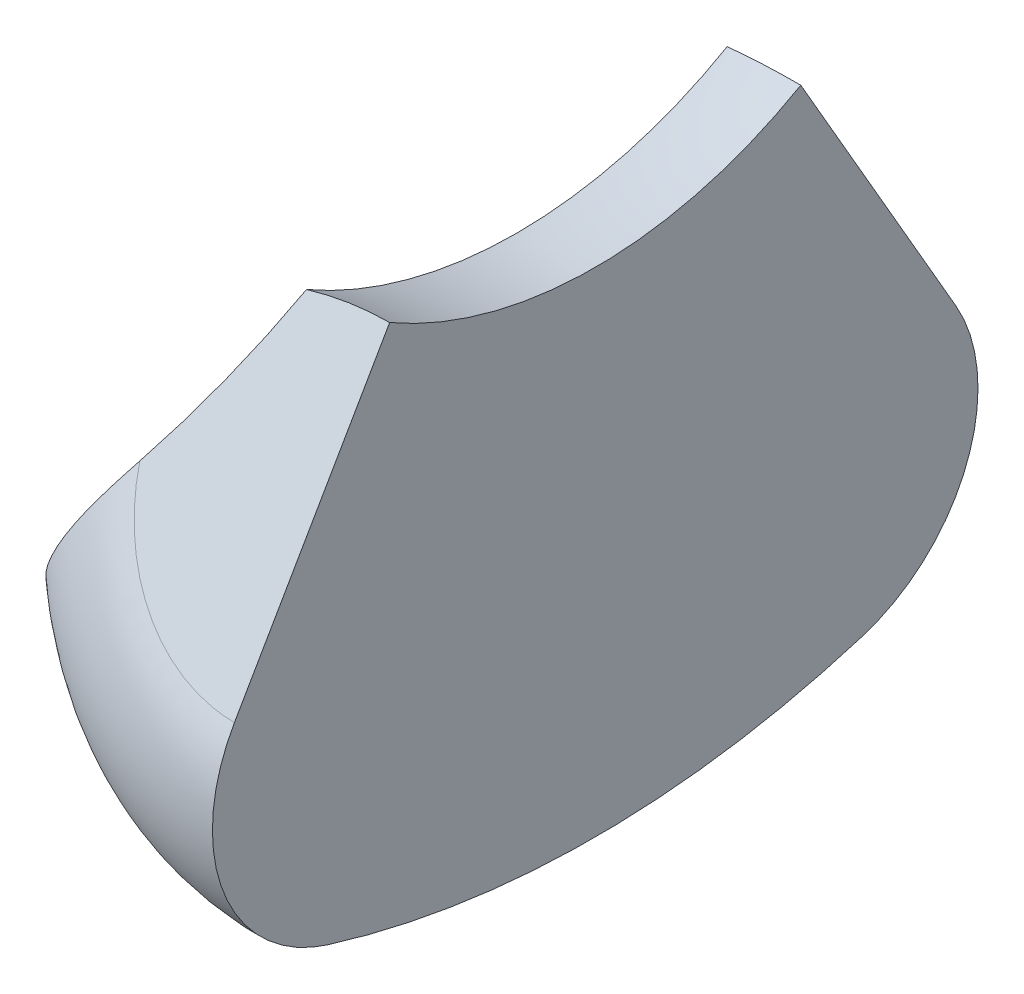
ISO-10303-21;
HEADER;
FILE_DESCRIPTION(('STEP AP214'),'2;1');
FILE_NAME('part.step','',(''),(''),'','','');
FILE_SCHEMA(('AUTOMOTIVE_DESIGN { 1 0 10303 214 1 1 1 1 }'));
ENDSEC;
DATA;
#1=APPLICATION_CONTEXT('core data for automotive mechanical design processes');
#2=APPLICATION_PROTOCOL_DEFINITION('international standard','automotive_design',2000,#1);
#3=PRODUCT_CONTEXT('',#1,'mechanical');
#4=PRODUCT('Part','Part','',(#3));
#5=PRODUCT_RELATED_PRODUCT_CATEGORY('part','',(#4));
#6=PRODUCT_DEFINITION_FORMATION('','',#4);
#7=PRODUCT_DEFINITION_CONTEXT('part definition',#1,'design');
#8=PRODUCT_DEFINITION('design','',#6,#7);
#9=PRODUCT_DEFINITION_SHAPE('','',#8);
#10=(LENGTH_UNIT() NAMED_UNIT(*) SI_UNIT(.MILLI.,.METRE.));
#11=(NAMED_UNIT(*) PLANE_ANGLE_UNIT() SI_UNIT($,.RADIAN.));
#12=(NAMED_UNIT(*) SI_UNIT($,.STERADIAN.) SOLID_ANGLE_UNIT());
#13=UNCERTAINTY_MEASURE_WITH_UNIT(LENGTH_MEASURE(1.E-05),#10,'distance_accuracy_value','');
#14=(GEOMETRIC_REPRESENTATION_CONTEXT(3) GLOBAL_UNCERTAINTY_ASSIGNED_CONTEXT((#13)) GLOBAL_UNIT_ASSIGNED_CONTEXT((#10,
#11,#12)) REPRESENTATION_CONTEXT('',''));
#15=CARTESIAN_POINT('',(0.,0.,0.));
#16=DIRECTION('',(0.,0.,1.));
#17=DIRECTION('',(1.,0.,0.));
#18=AXIS2_PLACEMENT_3D('',#15,#16,#17);
#19=CARTESIAN_POINT('',(14.2,0.,0.));
#20=DIRECTION('',(-1.,0.,0.));
#21=DIRECTION('',(0.,-1.,0.));
#22=AXIS2_PLACEMENT_3D('',#19,#20,#21);
#23=TOROIDAL_SURFACE('',#22,9.,4.);
#24=CARTESIAN_POINT('',(14.2,0.,0.));
#25=DIRECTION('',(-1.,0.,0.));
#26=DIRECTION('',(0.,-1.,0.));
#27=AXIS2_PLACEMENT_3D('',#24,#25,#26);
#28=CIRCLE('',#27,5.);
#29=CARTESIAN_POINT('',(14.2,-4.33012701892219,-2.50000000000001));
#30=VERTEX_POINT('',#29);
#31=CARTESIAN_POINT('',(14.2,-4.33012701892219,2.5));
#32=VERTEX_POINT('',#31);
#33=EDGE_CURVE('E132',#30,#32,#28,.T.);
#34=ORIENTED_EDGE('',*,*,#33,.F.);
#35=CARTESIAN_POINT('',(14.2,-7.79422863405994,-4.50000000000001));
#36=DIRECTION('',(0.,-0.500000000000001,0.866025403784438));
#37=DIRECTION('',(-1.,0.,0.));
#38=AXIS2_PLACEMENT_3D('',#35,#36,#37);
#39=CIRCLE('',#38,4.);
#40=CARTESIAN_POINT('',(13.2466613471033,-4.42995173409023,-2.55763382617405));
#41=VERTEX_POINT('',#40);
#42=EDGE_CURVE('E100',#30,#41,#39,.T.);
#43=ORIENTED_EDGE('',*,*,#42,.T.);
#44=CARTESIAN_POINT('',(13.2466613471033,0.,0.));
#45=DIRECTION('',(-1.,0.,0.));
#46=DIRECTION('',(0.,-1.,0.));
#47=AXIS2_PLACEMENT_3D('',#44,#45,#46);
#48=CIRCLE('',#47,5.11526765234809);
#49=CARTESIAN_POINT('',(13.2466613471033,-4.42995173409023,2.55763382617405));
#50=VERTEX_POINT('',#49);
#51=EDGE_CURVE('E95',#41,#50,#48,.T.);
#52=ORIENTED_EDGE('',*,*,#51,.T.);
#53=CARTESIAN_POINT('',(14.2,-7.79422863405994,4.50000000000001));
#54=DIRECTION('',(0.,0.500000000000001,0.866025403784438));
#55=DIRECTION('',(-1.,0.,0.));
#56=AXIS2_PLACEMENT_3D('',#53,#54,#55);
#57=CIRCLE('',#56,4.);
#58=EDGE_CURVE('E98',#32,#50,#57,.T.);
#59=ORIENTED_EDGE('',*,*,#58,.F.);
#60=EDGE_LOOP('',(#34,#43,#52,#59));
#61=FACE_BOUND('',#60,.T.);
#62=ADVANCED_FACE('F33',(#61),#23,.T.);
#63=CARTESIAN_POINT('',(14.2,-4.33012701892219,-2.50000000000001));
#64=DIRECTION('',(1.,0.,0.));
#65=DIRECTION('',(0.,1.,0.));
#66=AXIS2_PLACEMENT_3D('',#63,#64,#65);
#67=PLANE('',#66);
#68=CARTESIAN_POINT('',(14.2,0.,0.));
#69=DIRECTION('',(-1.,0.,0.));
#70=DIRECTION('',(0.,-1.,0.));
#71=AXIS2_PLACEMENT_3D('',#68,#69,#70);
#72=CIRCLE('',#71,11.);
#73=CARTESIAN_POINT('',(14.2,-10.5103069827376,-3.24552724971102));
#74=VERTEX_POINT('',#73);
#75=CARTESIAN_POINT('',(14.2,-10.5103069827376,3.24552724971101));
#76=VERTEX_POINT('',#75);
#77=EDGE_CURVE('E129',#74,#76,#72,.T.);
#78=ORIENTED_EDGE('',*,*,#77,.F.);
#79=CARTESIAN_POINT('',(14.1999999999999,-8.59934207678548,-2.65543138612728));
#80=DIRECTION('',(1.,0.,0.));
#81=DIRECTION('',(0.,1.,0.));
#82=AXIS2_PLACEMENT_3D('',#79,#80,#81);
#83=CIRCLE('',#82,2.);
#84=CARTESIAN_POINT('',(14.2,-7.59934207678532,-4.38748219369607));
#85=VERTEX_POINT('',#84);
#86=EDGE_CURVE('E192',#74,#85,#83,.T.);
#87=ORIENTED_EDGE('',*,*,#86,.T.);
#88=DIRECTION('',(0.,0.866025403784438,0.500000000000001));
#89=VECTOR('',#88,1.);
#90=CARTESIAN_POINT('',(14.2,-4.33012701892219,-2.50000000000001));
#91=LINE('',#90,#89);
#92=EDGE_CURVE('E102',#85,#30,#91,.T.);
#93=ORIENTED_EDGE('',*,*,#92,.T.);
#94=ORIENTED_EDGE('',*,*,#33,.T.);
#95=DIRECTION('',(0.,0.866025403784438,-0.500000000000001));
#96=VECTOR('',#95,1.);
#97=CARTESIAN_POINT('',(14.2,-4.33012701892219,2.5));
#98=LINE('',#97,#96);
#99=CARTESIAN_POINT('',(14.2,-7.59934207678532,4.38748219369607));
#100=VERTEX_POINT('',#99);
#101=EDGE_CURVE('E108',#100,#32,#98,.T.);
#102=ORIENTED_EDGE('',*,*,#101,.F.);
#103=CARTESIAN_POINT('',(14.2,-8.59934207678547,2.65543138612727));
#104=DIRECTION('',(1.,0.,0.));
#105=DIRECTION('',(0.,1.,0.));
#106=AXIS2_PLACEMENT_3D('',#103,#104,#105);
#107=CIRCLE('',#106,2.);
#108=EDGE_CURVE('E208',#100,#76,#107,.T.);
#109=ORIENTED_EDGE('',*,*,#108,.T.);
#110=EDGE_LOOP('',(#78,#87,#93,#94,#102,#109));
#111=FACE_BOUND('',#110,.T.);
#112=ADVANCED_FACE('F153',(#111),#67,.T.);
#113=CARTESIAN_POINT('',(14.2,0.,0.));
#114=DIRECTION('',(-1.,0.,0.));
#115=DIRECTION('',(0.,-1.,0.));
#116=AXIS2_PLACEMENT_3D('',#113,#114,#115);
#117=TOROIDAL_SURFACE('',#116,7.,4.);
#118=CARTESIAN_POINT('',(10.8407822103364,0.,0.));
#119=DIRECTION('',(-1.,0.,0.));
#120=DIRECTION('',(0.,-1.,0.));
#121=AXIS2_PLACEMENT_3D('',#118,#119,#120);
#122=CIRCLE('',#121,9.17155608760339);
#123=CARTESIAN_POINT('',(10.8407822103364,-8.83027431117204,-2.47864815121266));
#124=VERTEX_POINT('',#123);
#125=CARTESIAN_POINT('',(10.8407822103364,-8.83027431117204,2.47864815121265));
#126=VERTEX_POINT('',#125);
#127=EDGE_CURVE('E101',#124,#126,#122,.T.);
#128=ORIENTED_EDGE('',*,*,#127,.F.);
#129=CARTESIAN_POINT('',(12.2249032960197,-5.52454645390097,-3.18959838231033));
#130=CARTESIAN_POINT('',(10.3385819820484,-5.2762326548454,-3.04623434358209));
#131=CARTESIAN_POINT('',(10.2498065920394,-6.21748362648852,-1.3889514382053));
#132=CARTESIAN_POINT('',(12.2155894488538,-5.577622661398,-3.22024194499631));
#133=CARTESIAN_POINT('',(10.3037202512503,-5.3735018871853,-3.10239276105741));
#134=CARTESIAN_POINT('',(10.2311788977065,-6.32782190660059,-1.43150047388376));
#135=CARTESIAN_POINT('',(12.2088690584926,-5.63101476867328,-3.25106789250429));
#136=CARTESIAN_POINT('',(10.2737721738444,-5.47232193938927,-3.1594465447987));
#137=CARTESIAN_POINT('',(10.2177381169845,-6.43878325731117,-1.47481684447684));
#138=CARTESIAN_POINT('',(12.2006785074126,-5.73810593375173,-3.31289700549016));
#139=CARTESIAN_POINT('',(10.2238351894735,-5.67336435075574,-3.27551843511967));
#140=CARTESIAN_POINT('',(10.2013570148259,-6.66127031068925,-1.56265854102597));
#141=CARTESIAN_POINT('',(12.1992089579181,-5.79180502656089,-3.34390019117877));
#142=CARTESIAN_POINT('',(10.2039407579885,-5.77558965351556,-3.33453824118604));
#143=CARTESIAN_POINT('',(10.1984179158376,-6.77279607754458,-1.60718400711898));
#144=CARTESIAN_POINT('',(12.2027727866078,-5.95280526146827,-3.43685372014214));
#145=CARTESIAN_POINT('',(10.1599847060356,-6.08768426836323,-3.51472615108097));
#146=CARTESIAN_POINT('',(10.2055455732148,-7.10705143145941,-1.74202710296695));
#147=CARTESIAN_POINT('',(12.215769597685,-6.06006084841535,-3.49877776213813));
#148=CARTESIAN_POINT('',(10.1525545493161,-6.30038126076179,-3.6375268168981));
#149=CARTESIAN_POINT('',(10.2315391953613,-7.32956612160526,-1.83365283209383));
#150=CARTESIAN_POINT('',(12.2626663328305,-6.26954753000947,-3.61972495414813));
#151=CARTESIAN_POINT('',(10.1837650805238,-6.7267846788366,-3.88371094510697));
#152=CARTESIAN_POINT('',(10.3253326656695,-7.76384508951257,-2.01553667719363));
#153=CARTESIAN_POINT('',(12.296283359369,-6.37182674074108,-3.67877588399653));
#154=CARTESIAN_POINT('',(10.2224876329642,-6.94020337010627,-4.00692828396162));
#155=CARTESIAN_POINT('',(10.392566718771,-7.97571357204845,-2.10579664316646));
#156=CARTESIAN_POINT('',(12.3835233684967,-6.56976705220837,-3.79305677610565));
#157=CARTESIAN_POINT('',(10.3474640813605,-7.36304315397121,-4.25105494700012));
#158=CARTESIAN_POINT('',(10.5670467370155,-8.38545025612664,-2.28270066936003));
#159=CARTESIAN_POINT('',(12.4371374491575,-6.66543107534529,-3.84828842561551));
#160=CARTESIAN_POINT('',(10.4342693563477,-7.57201990789643,-4.37170773213323));
#161=CARTESIAN_POINT('',(10.6742748983016,-8.58332464075198,-2.36934631948297));
#162=CARTESIAN_POINT('',(12.5610446536194,-6.84415409626259,-3.9514742098525));
#163=CARTESIAN_POINT('',(10.6521539988476,-7.9705265283923,-4.60178563675036));
#164=CARTESIAN_POINT('',(10.9220893072518,-8.95276544976622,-2.53281833641504));
#165=CARTESIAN_POINT('',(12.6307547132948,-6.92751669201741,-3.99960362695189));
#166=CARTESIAN_POINT('',(10.782137038053,-8.16000250021316,-4.7111796400861));
#167=CARTESIAN_POINT('',(11.061509426661,-9.1249673112014,-2.6098690046903));
#168=CARTESIAN_POINT('',(12.7858394943639,-7.08240487400438,-4.08902836051636));
#169=CARTESIAN_POINT('',(11.0848329752697,-8.51812215602699,-4.91794011977231));
#170=CARTESIAN_POINT('',(11.3716789887918,-9.44475225553772,-2.75406933757755));
#171=CARTESIAN_POINT('',(12.8711955407349,-7.1539443807018,-4.13033171396581));
#172=CARTESIAN_POINT('',(11.2576349749836,-8.68620641471867,-5.01498361177449));
#173=CARTESIAN_POINT('',(11.5423910814682,-9.59236429207303,-2.82123063559038));
#174=CARTESIAN_POINT('',(13.019487022849,-7.25789772709348,-4.19034920648821));
#175=CARTESIAN_POINT('',(11.5663860338082,-8.93346093979017,-5.15773607838288));
#176=CARTESIAN_POINT('',(11.838974045699,-9.80676977121457,-2.91933635682062));
#177=CARTESIAN_POINT('',(13.0783479421257,-7.29475083663195,-4.21162635920072));
#178=CARTESIAN_POINT('',(11.6910699854732,-9.02196595245914,-5.20883447127194));
#179=CARTESIAN_POINT('',(11.9566958842787,-9.8827570739802,-2.95424971288262));
#180=CARTESIAN_POINT('',(13.2003514967133,-7.36266324779574,-4.25083560806745));
#181=CARTESIAN_POINT('',(11.9530675630893,-9.18622931836544,-5.30367196979594));
#182=CARTESIAN_POINT('',(12.2007029934421,-10.0227548496447,-3.01876152903963));
#183=CARTESIAN_POINT('',(13.2634929818505,-7.39372409743468,-4.26876859796775));
#184=CARTESIAN_POINT('',(12.0903245166477,-9.26186665514571,-5.34734120654681));
#185=CARTESIAN_POINT('',(12.3269859636783,-10.0867685225766,-3.04836140911134));
#186=CARTESIAN_POINT('',(13.426866934179,-7.46405906788514,-4.30937651209077));
#187=CARTESIAN_POINT('',(12.4495711753079,-9.43430335600853,-5.44689758220814));
#188=CARTESIAN_POINT('',(12.6537338683924,-10.2316978474835,-3.11552549729447));
#189=CARTESIAN_POINT('',(13.5294502653464,-7.49932125831168,-4.32973514722575));
#190=CARTESIAN_POINT('',(12.678043757278,-9.52137936747143,-5.4971709408662));
#191=CARTESIAN_POINT('',(12.8589005309015,-10.3043324636602,-3.14933724778629));
#192=CARTESIAN_POINT('',(13.7401028732581,-7.55449077162285,-4.36158728058701));
#193=CARTESIAN_POINT('',(13.1520693035712,-9.6584238029765,-5.57629358259599));
#194=CARTESIAN_POINT('',(13.2802057467733,-10.41795751653,-3.20232097860054));
#195=CARTESIAN_POINT('',(13.8481800576314,-7.57437525290083,-4.37306759120555));
#196=CARTESIAN_POINT('',(13.3972296830308,-9.70806916418562,-5.60495634525409));
#197=CARTESIAN_POINT('',(13.4963601153937,-10.4589008800267,-3.22147118065998));
#198=CARTESIAN_POINT('',(14.0666721029376,-7.5980781605443,-4.38675247131408));
#199=CARTESIAN_POINT('',(13.895254049998,-9.76741190161116,-5.63921789068118));
#200=CARTESIAN_POINT('',(13.9333442057444,-10.5077054071713,-3.24430520099778));
#201=CARTESIAN_POINT('',(14.1770857775064,-7.60190455266925,-4.38896163983745));
#202=CARTESIAN_POINT('',(14.1476236690124,-9.77700994786705,-5.64475932527071));
#203=CARTESIAN_POINT('',(14.1541715547468,-10.5155829734055,-3.24799668770889));
#204=CARTESIAN_POINT('',(14.3419663510373,-7.59553813623247,-4.3852859875939));
#205=CARTESIAN_POINT('',(14.5244096539128,-9.76104506846745,-5.63554199785177));
#206=CARTESIAN_POINT('',(14.4839327019225,-10.502475006721,-3.2418607298531));
#207=CARTESIAN_POINT('',(14.3968271453934,-7.59139384774936,-4.38289328152258));
#208=CARTESIAN_POINT('',(14.6496449019071,-9.75065908857438,-5.6295456495647));
#209=CARTESIAN_POINT('',(14.5936542907256,-10.4939424035436,-3.2378655576804));
#210=CARTESIAN_POINT('',(14.5059509319979,-7.5791106298516,-4.37580156236279));
#211=CARTESIAN_POINT('',(14.8983271397571,-9.71991068070146,-5.61179304800212));
#212=CARTESIAN_POINT('',(14.811901864054,-10.4686510021424,-3.22603334800435));
#213=CARTESIAN_POINT('',(14.5602139072838,-7.57097158738646,-4.37110248400459));
#214=CARTESIAN_POINT('',(15.0217129242231,-9.69956337365273,-5.60004552480026));
#215=CARTESIAN_POINT('',(14.9204278146543,-10.4518919711129,-3.21819620177416));
#216=CARTESIAN_POINT('',(14.61400911174,-7.5608588727377,-4.3652639054799));
#217=CARTESIAN_POINT('',(15.143744413636,-9.67431330365864,-5.58546739009211));
#218=CARTESIAN_POINT('',(15.0280182234801,-10.4310675944497,-3.20846590549112));
#219=(BOUNDED_SURFACE() B_SPLINE_SURFACE(3,2,((#129,#130,#131),(#132,#133,#134),(#135,#136,
#137),(#138,#139,#140),(#141,#142,#143),(#144,#145,#146),(#147,#148,#149),(#150,#151,#152),
(#153,#154,#155),(#156,#157,#158),(#159,#160,#161),(#162,#163,#164),(#165,#166,#167),(#168,#169,
#170),(#171,#172,#173),(#174,#175,#176),(#177,#178,#179),(#180,#181,#182),(#183,#184,#185),
(#186,#187,#188),(#189,#190,#191),(#192,#193,#194),(#195,#196,#197),(#198,#199,#200),(#201,#202,
#203),(#204,#205,#206),(#207,#208,#209),(#210,#211,#212),(#213,#214,#215),(#216,#217,#218)),
.UNSPECIFIED.,.F.,.F.,.F.) B_SPLINE_SURFACE_WITH_KNOTS((4,2,2,2,2,2,2,2,2,2,2,2,2,2,4),(3,3),
(0.,0.185857798137875,0.371737230351368,0.7433180189816,1.10991154519576,1.47634207230365,
1.83114831689517,2.18553379086519,2.40303552379177,2.62047904460288,2.9499393591644,
3.27988810964002,3.60967316671135,3.77471069254347,3.93975288916325),(0.,1.),
.UNSPECIFIED.) GEOMETRIC_REPRESENTATION_ITEM() RATIONAL_B_SPLINE_SURFACE(((1.,0.723554665672272,
1.),(1.,0.72038971221704,1.),(1.,0.717264802827632,1.),(1.,0.71110910886469,1.),(1.,
0.70807833528974,1.),(1.,0.69915222345318,1.),(1.,0.693420034095531,1.),(1.,0.682586924133604,
1.),(1.,0.677478563416475,1.),(1.,0.667877940081129,1.),(1.,0.66338540453607,1.),(1.,
0.655203635171287,1.),(1.,0.6514934392586,1.),(1.,0.644740931009477,1.),(1.,0.641697831836822,
1.),(1.,0.637347129010042,1.),(1.,0.63582319140784,1.),(1.,0.633039194900552,1.),(1.,
0.631779065480192,1.),(1.,0.628944968736906,1.),(1.,0.627543743821374,1.),(1.,0.625363353672976,
1.),(1.,0.624585113744113,1.),(1.,0.623658343696233,1.),(1.,0.623509501358605,1.),(1.,
0.623758007431819,1.),(1.,0.623919645784626,1.),(1.,0.624400016195136,1.),(1.,0.624718752698677,
1.),(1.,0.625115826088795,1.))) REPRESENTATION_ITEM('') SURFACE());
#220=CARTESIAN_POINT('',(10.2498065920394,-6.21748362648852,-1.3889514382053));
#221=CARTESIAN_POINT('',(10.2311788977065,-6.32782190660059,-1.43150047388376));
#222=CARTESIAN_POINT('',(10.2177381169845,-6.43878325731117,-1.47481684447684));
#223=CARTESIAN_POINT('',(10.2013570148259,-6.66127031068925,-1.56265854102597));
#224=CARTESIAN_POINT('',(10.1984179158376,-6.77279607754458,-1.60718400711898));
#225=CARTESIAN_POINT('',(10.2055455732148,-7.10705143145941,-1.74202710296695));
#226=CARTESIAN_POINT('',(10.2315391953613,-7.32956612160526,-1.83365283209383));
#227=CARTESIAN_POINT('',(10.3253326656695,-7.76384508951257,-2.01553667719363));
#228=CARTESIAN_POINT('',(10.392566718771,-7.97571357204845,-2.10579664316646));
#229=CARTESIAN_POINT('',(10.5670467370155,-8.38545025612664,-2.28270066936003));
#230=CARTESIAN_POINT('',(10.6742748983016,-8.58332464075198,-2.36934631948297));
#231=CARTESIAN_POINT('',(10.9220893072518,-8.95276544976622,-2.53281833641504));
#232=CARTESIAN_POINT('',(11.061509426661,-9.1249673112014,-2.6098690046903));
#233=CARTESIAN_POINT('',(11.3716789887918,-9.44475225553772,-2.75406933757755));
#234=CARTESIAN_POINT('',(11.5423910814682,-9.59236429207303,-2.82123063559038));
#235=CARTESIAN_POINT('',(11.838974045699,-9.80676977121457,-2.91933635682062));
#236=CARTESIAN_POINT('',(11.9566958842787,-9.8827570739802,-2.95424971288262));
#237=CARTESIAN_POINT('',(12.2007029934421,-10.0227548496447,-3.01876152903963));
#238=CARTESIAN_POINT('',(12.3269859636783,-10.0867685225766,-3.04836140911134));
#239=CARTESIAN_POINT('',(12.6537338683924,-10.2316978474835,-3.11552549729447));
#240=CARTESIAN_POINT('',(12.8589005309015,-10.3043324636602,-3.14933724778629));
#241=CARTESIAN_POINT('',(13.2802057467733,-10.41795751653,-3.20232097860054));
#242=CARTESIAN_POINT('',(13.4963601153937,-10.4589008800267,-3.22147118065998));
#243=CARTESIAN_POINT('',(13.9333442057444,-10.5077054071713,-3.24430520099778));
#244=CARTESIAN_POINT('',(14.1541715547468,-10.5155829734055,-3.24799668770889));
#245=CARTESIAN_POINT('',(14.4839327019225,-10.502475006721,-3.2418607298531));
#246=CARTESIAN_POINT('',(14.5936542907256,-10.4939424035436,-3.2378655576804));
#247=CARTESIAN_POINT('',(14.811901864054,-10.4686510021424,-3.22603334800435));
#248=CARTESIAN_POINT('',(14.9204278146543,-10.4518919711129,-3.21819620177416));
#249=CARTESIAN_POINT('',(15.0280182234801,-10.4310675944497,-3.20846590549112));
#250=B_SPLINE_CURVE_WITH_KNOTS('',3,(#220,#221,#222,#223,#224,#225,#226,#227,#228,#229,#230,
#231,#232,#233,#234,#235,#236,#237,#238,#239,#240,#241,#242,#243,#244,#245,#246,#247,#248,#249),
.UNSPECIFIED.,.F.,.F.,(4,2,2,2,2,2,2,2,2,2,2,2,2,2,4),(0.,0.185857798137875,0.371737230351368,
0.7433180189816,1.10991154519576,1.47634207230365,1.83114831689517,2.18553379086519,
2.40303552379177,2.62047904460288,2.9499393591644,3.27988810964002,3.60967316671135,
3.77471069254347,3.93975288916325),.UNSPECIFIED.);
#251=EDGE_CURVE('E141',#124,#74,#250,.T.);
#252=ORIENTED_EDGE('',*,*,#251,.T.);
#253=ORIENTED_EDGE('',*,*,#77,.T.);
#254=CARTESIAN_POINT('',(14.9849356055584,-7.45674109076653,4.30515147603141));
#255=CARTESIAN_POINT('',(15.9761446057498,-9.41629966703639,5.43650314753365));
#256=CARTESIAN_POINT('',(15.7698712111168,-10.2166128150827,3.10857019054481));
#257=CARTESIAN_POINT('',(14.9336646452154,-7.47619167786341,4.31638127772769));
#258=CARTESIAN_POINT('',(15.8624423868553,-9.46422563634474,5.46417321881501));
#259=CARTESIAN_POINT('',(15.6673292909931,-10.2566852345395,3.12718081691162));
#260=CARTESIAN_POINT('',(14.8814604657359,-7.49373855668852,4.3265119729408));
#261=CARTESIAN_POINT('',(15.7460695949088,-9.50757159870966,5.48919902185468));
#262=CARTESIAN_POINT('',(15.5629209318455,-10.2928305137489,3.14399771401151));
#263=CARTESIAN_POINT('',(14.7755119120426,-7.52490950323707,4.3445085273215));
#264=CARTESIAN_POINT('',(15.5085832562822,-9.58482162254917,5.53379934391332));
#265=CARTESIAN_POINT('',(15.3510238237034,-10.3570341962179,3.17390545637616));
#266=CARTESIAN_POINT('',(14.7217674940146,-7.53853345924521,4.35237432199023));
#267=CARTESIAN_POINT('',(15.3875212790844,-9.61868690927099,5.55335147631835));
#268=CARTESIAN_POINT('',(15.2435349870803,-10.3850923691763,3.18699619552889));
#269=CARTESIAN_POINT('',(14.5587752926045,-7.57333405123417,4.37246645314302));
#270=CARTESIAN_POINT('',(15.0186030107985,-9.70546326453962,5.60345182839199));
#271=CARTESIAN_POINT('',(14.9175505836771,-10.456758916319,3.22045801817622));
#272=CARTESIAN_POINT('',(14.4477135818413,-7.58846024849375,4.38119956720265));
#273=CARTESIAN_POINT('',(14.7657819995044,-9.74331090999125,5.62530317668168));
#274=CARTESIAN_POINT('',(14.6954271632506,-10.4879022372581,3.23503870401007));
#275=CARTESIAN_POINT('',(14.2260716050206,-7.60189170174614,4.38895422035353));
#276=CARTESIAN_POINT('',(14.2596165654579,-9.77697766162001,5.64474068479728));
#277=CARTESIAN_POINT('',(14.2521432104664,-10.5155565185088,3.2479843445893));
#278=CARTESIAN_POINT('',(14.1155111660432,-7.60045737330818,4.38812611044376));
#279=CARTESIAN_POINT('',(14.0068483533331,-9.77337920014937,5.64266311209854));
#280=CARTESIAN_POINT('',(14.0310223322896,-10.5126036441138,3.24660034557955));
#281=CARTESIAN_POINT('',(13.896403725156,-7.58146466419023,4.37716066472188));
#282=CARTESIAN_POINT('',(13.5069202904571,-9.7257992554562,5.61519281822191));
#283=CARTESIAN_POINT('',(13.5928074502959,-10.4734983963361,3.22829882261508));
#284=CARTESIAN_POINT('',(13.7878532962421,-7.56393693043034,4.36704102291732));
#285=CARTESIAN_POINT('',(13.2602480685989,-9.68199021106122,5.58989965464753));
#286=CARTESIAN_POINT('',(13.3757065924701,-10.4374091251039,3.21141082317559));
#287=CARTESIAN_POINT('',(13.6209488380666,-7.5241636765338,4.34407792407361));
#288=CARTESIAN_POINT('',(12.883437536899,-9.58296983598186,5.5327302144402));
#289=CARTESIAN_POINT('',(13.0418976761414,-10.3554978608482,3.17319064319986));
#290=CARTESIAN_POINT('',(13.5608845487427,-7.50709675232159,4.33422433078544));
#291=CARTESIAN_POINT('',(12.7486219656932,-9.54063661079975,5.50828911548564));
#292=CARTESIAN_POINT('',(12.9217690975057,-10.3203465337705,3.15680490809211));
#293=CARTESIAN_POINT('',(13.4429237611839,-7.46804251663361,4.31167635729799));
#294=CARTESIAN_POINT('',(12.4854980325246,-9.44412954222966,5.452570733468));
#295=CARTESIAN_POINT('',(12.6858475223786,-10.2398974867141,3.11937649559228));
#296=CARTESIAN_POINT('',(13.3850276437258,-7.44605434556979,4.29898148081531));
#297=CARTESIAN_POINT('',(12.3572599157664,-9.39001411477072,5.42132717685727));
#298=CARTESIAN_POINT('',(12.5700552874405,-10.1945979941667,3.09833300464289));
#299=CARTESIAN_POINT('',(13.227382378156,-7.37816412837936,4.25978504564507));
#300=CARTESIAN_POINT('',(12.0113581424598,-9.22392808106295,5.32543736058745));
#301=CARTESIAN_POINT('',(12.2547647563319,-10.054706418093,3.03350197650778));
#302=CARTESIAN_POINT('',(13.1305192664756,-7.32705312938213,4.23027609661547));
#303=CARTESIAN_POINT('',(11.8021510985353,-9.09989091119293,5.25382446717348));
#304=CARTESIAN_POINT('',(12.0610385330959,-9.94936268280706,2.98484125910576));
#305=CARTESIAN_POINT('',(12.9938442331154,-7.24037347725549,4.18023157612689));
#306=CARTESIAN_POINT('',(11.5125932234723,-8.89153976329912,5.13353287585102));
#307=CARTESIAN_POINT('',(11.7876884663191,-9.77062737537769,2.90278834614662));
#308=CARTESIAN_POINT('',(12.9496836733278,-7.20977668372276,4.16256650914443));
#309=CARTESIAN_POINT('',(11.4203356262214,-8.81857786009994,5.09140830139838));
#310=CARTESIAN_POINT('',(11.6993673466842,-9.70752402063096,2.87389447680387));
#311=CARTESIAN_POINT('',(12.8644577557454,-7.1454416389998,4.1254226537553));
#312=CARTESIAN_POINT('',(11.2446435048624,-8.66617087589369,5.00341608804053));
#313=CARTESIAN_POINT('',(11.5289155114682,-9.57480640343743,2.81332973435026));
#314=CARTESIAN_POINT('',(12.823394823544,-7.11170097127539,4.10594247016198));
#315=CARTESIAN_POINT('',(11.1612207690762,-8.5867847629914,4.95758249438648));
#316=CARTESIAN_POINT('',(11.446789647074,-9.50518713235475,2.78165672616712));
#317=CARTESIAN_POINT('',(12.7055342750001,-7.0063487735238,4.04511735043038));
#318=CARTESIAN_POINT('',(10.9261663985725,-8.34129144732238,4.81584686250071));
#319=CARTESIAN_POINT('',(11.2110685500284,-9.2877497675492,2.68311085780022));
#320=CARTESIAN_POINT('',(12.6337778702411,-6.93042413134228,4.00128223782875));
#321=CARTESIAN_POINT('',(10.7880007024205,-8.16665505703986,4.71502049556079));
#322=CARTESIAN_POINT('',(11.0675557405608,-9.13097505424849,2.6125372664866));
#323=CARTESIAN_POINT('',(12.505661797137,-6.76938337933103,3.90830531630456));
#324=CARTESIAN_POINT('',(10.5525437210709,-7.80253646696899,4.50479652956643));
#325=CARTESIAN_POINT('',(10.8113235943463,-8.79823749322639,2.46421684179907));
#326=CARTESIAN_POINT('',(12.4493057191794,-6.68426513257355,3.85916227362618));
#327=CARTESIAN_POINT('',(10.4550226093863,-7.61353369169224,4.39567572638281));
#328=CARTESIAN_POINT('',(10.6986114383745,-8.62227018435481,2.38646834132967));
#329=CARTESIAN_POINT('',(12.3767641912758,-6.5506711314286,3.78203174110302));
#330=CARTESIAN_POINT('',(10.338857067016,-7.32176111511696,4.22722075075492));
#331=CARTESIAN_POINT('',(10.5535283825437,-8.34589980101259,2.26580391788466));
#332=CARTESIAN_POINT('',(12.3544132677143,-6.50463712346044,3.75545399421072));
#333=CARTESIAN_POINT('',(10.3050689133653,-7.22256656335714,4.16995074959424));
#334=CARTESIAN_POINT('',(10.5088265354234,-8.25063647877304,2.22445179144738));
#335=CARTESIAN_POINT('',(12.3141641505139,-6.4111825204655,3.70149795401459));
#336=CARTESIAN_POINT('',(10.2482074200657,-7.0233338140469,4.05492366814858));
#337=CARTESIAN_POINT('',(10.4283283010348,-8.05717314743199,2.14102356643253));
#338=CARTESIAN_POINT('',(12.2962616508941,-6.36376331637358,3.67412046376736));
#339=CARTESIAN_POINT('',(10.2250637103814,-6.92334318432379,3.99719405116151));
#340=CARTESIAN_POINT('',(10.3925233018047,-7.95897608211665,2.09894821045036));
#341=CARTESIAN_POINT('',(12.2493068597192,-6.21976521546232,3.59098312144345));
#342=CARTESIAN_POINT('',(10.1715405661158,-6.62415370308036,3.82445692362691));
#343=CARTESIAN_POINT('',(10.2986137194643,-7.66067443919275,1.97205577066072));
#344=CARTESIAN_POINT('',(12.2270215486102,-6.12147227793162,3.53423366750066));
#345=CARTESIAN_POINT('',(10.1563090411925,-6.42391164707912,3.70884711869151));
#346=CARTESIAN_POINT('',(10.2540430972262,-7.45691412228742,1.88659629045952));
#347=CARTESIAN_POINT('',(12.200438074035,-5.91971747470017,3.41775047754468));
#348=CARTESIAN_POINT('',(10.1657669469616,-6.02282015807835,3.47727683954725));
#349=CARTESIAN_POINT('',(10.200876148064,-7.03838222061768,1.71408772837787));
#350=CARTESIAN_POINT('',(12.1967726443183,-5.81619314078775,3.35798067549267));
#351=CARTESIAN_POINT('',(10.1911702962402,-5.82224331678567,3.36147374623371));
#352=CARTESIAN_POINT('',(10.1935452886394,-6.82347114118277,1.62708240185456));
#353=CARTESIAN_POINT('',(12.2058691705892,-5.66166599198026,3.26876438453156));
#354=CARTESIAN_POINT('',(10.2582224873196,-5.52948000909198,3.19244677172792));
#355=CARTESIAN_POINT('',(10.2117383411818,-6.50247196266839,1.49984009732543));
#356=CARTESIAN_POINT('',(12.2113369569028,-5.61027085649422,3.23909138922365));
#357=CARTESIAN_POINT('',(10.285144884161,-5.43382180395545,3.13721848124214));
#358=CARTESIAN_POINT('',(10.2226739138071,-6.39567384200186,1.45796030151358));
#359=CARTESIAN_POINT('',(12.2270708205939,-5.50803642618046,3.18006631336156));
#360=CARTESIAN_POINT('',(10.347885026138,-5.24611471632765,3.02884574367143));
#361=CARTESIAN_POINT('',(10.2541416411863,-6.1831708820644,1.37557537303412));
#362=CARTESIAN_POINT('',(12.2373366858806,-5.4571971068855,3.1507142186812));
#363=CARTESIAN_POINT('',(10.3836220730062,-5.15405476574359,2.97569490642014));
#364=CARTESIAN_POINT('',(10.2746733717588,-6.07746599468008,1.33507017968949));
#365=CARTESIAN_POINT('',(12.2499663742985,-5.40678037843004,3.12160610693578));
#366=CARTESIAN_POINT('',(10.423693624695,-5.06363353845519,2.92349018650473));
#367=CARTESIAN_POINT('',(10.2999327485969,-5.97261261637239,1.29538941901105));
#368=(BOUNDED_SURFACE() B_SPLINE_SURFACE(3,2,((#254,#255,#256),(#257,#258,#259),(#260,#261,
#262),(#263,#264,#265),(#266,#267,#268),(#269,#270,#271),(#272,#273,#274),(#275,#276,#277),
(#278,#279,#280),(#281,#282,#283),(#284,#285,#286),(#287,#288,#289),(#290,#291,#292),(#293,#294,
#295),(#296,#297,#298),(#299,#300,#301),(#302,#303,#304),(#305,#306,#307),(#308,#309,#310),
(#311,#312,#313),(#314,#315,#316),(#317,#318,#319),(#320,#321,#322),(#323,#324,#325),(#326,#327,
#328),(#329,#330,#331),(#332,#333,#334),(#335,#336,#337),(#338,#339,#340),(#341,#342,#343),
(#344,#345,#346),(#347,#348,#349),(#350,#351,#352),(#353,#354,#355),(#356,#357,#358),(#359,#360,
#361),(#362,#363,#364),(#365,#366,#367)),.UNSPECIFIED.,.F.,.F.,
.F.) B_SPLINE_SURFACE_WITH_KNOTS((4,2,2,2,2,2,2,2,2,2,2,2,2,2,2,2,2,2,4),(3,3),(0.,
0.16781767943948,0.335640137445956,0.671107369220793,1.00130663160934,1.33087839169057,
1.52025468254189,1.70966407736456,2.04800521546968,2.21750649101766,2.38713914548624,
2.72534907312853,3.06363778291208,3.2364571227716,3.40910851969458,3.75451121848952,
4.11157627599523,4.29019737250632,4.46881057413162),(0.,1.),
.UNSPECIFIED.) GEOMETRIC_REPRESENTATION_ITEM() RATIONAL_B_SPLINE_SURFACE(((1.,0.629244457050967,
1.),(1.,0.628465910198575,1.),(1.,0.627767496445484,1.),(1.,0.626531568614565,1.),(1.,
0.625994059118882,1.),(1.,0.624624380537014,1.),(1.,0.624034235742752,1.),(1.,0.623510007225912,
1.),(1.,0.623565766654515,1.),(1.,0.624307653625026,1.),(1.,0.624992583029983,1.),(1.,
0.626561250071192,1.),(1.,0.627236476659767,1.),(1.,0.628791095509568,1.),(1.,0.629670523439396,
1.),(1.,0.632405922699654,1.),(1.,0.634486030084998,1.),(1.,0.638079234779655,1.),(1.,
0.639357287247737,1.),(1.,0.642070711480831,1.),(1.,0.643506204414809,1.),(1.,0.648036219763668,
1.),(1.,0.651361763431026,1.),(1.,0.658598494127641,1.),(1.,0.662509817395388,1.),(1.,
0.668825853562085,1.),(1.,0.671031702730829,1.),(1.,0.675576582260252,1.),(1.,0.67791548111456,
1.),(1.,0.685128745166831,1.),(1.,0.690198437408236,1.),(1.,0.700958583419514,1.),(1.,
0.706664217240154,1.),(1.,0.715489065565745,1.),(1.,0.718475854624022,1.),(1.,0.72452302178763,
1.),(1.,0.72758339663456,1.),(1.,0.730673291641164,1.))) REPRESENTATION_ITEM('') SURFACE());
#369=CARTESIAN_POINT('',(15.7698712111168,-10.2166128150827,3.10857019054481));
#370=CARTESIAN_POINT('',(15.6673292909931,-10.2566852345395,3.12718081691162));
#371=CARTESIAN_POINT('',(15.5629209318455,-10.2928305137489,3.14399771401151));
#372=CARTESIAN_POINT('',(15.3510238237034,-10.3570341962179,3.17390545637616));
#373=CARTESIAN_POINT('',(15.2435349870803,-10.3850923691763,3.18699619552889));
#374=CARTESIAN_POINT('',(14.9175505836771,-10.456758916319,3.22045801817622));
#375=CARTESIAN_POINT('',(14.6954271632506,-10.4879022372581,3.23503870401007));
#376=CARTESIAN_POINT('',(14.2521432104664,-10.5155565185088,3.2479843445893));
#377=CARTESIAN_POINT('',(14.0310223322896,-10.5126036441138,3.24660034557955));
#378=CARTESIAN_POINT('',(13.5928074502959,-10.4734983963361,3.22829882261508));
#379=CARTESIAN_POINT('',(13.3757065924701,-10.4374091251039,3.21141082317559));
#380=CARTESIAN_POINT('',(13.0418976761414,-10.3554978608482,3.17319064319986));
#381=CARTESIAN_POINT('',(12.9217690975057,-10.3203465337705,3.15680490809211));
#382=CARTESIAN_POINT('',(12.6858475223786,-10.2398974867141,3.11937649559228));
#383=CARTESIAN_POINT('',(12.5700552874405,-10.1945979941667,3.09833300464289));
#384=CARTESIAN_POINT('',(12.2547647563319,-10.054706418093,3.03350197650778));
#385=CARTESIAN_POINT('',(12.0610385330959,-9.94936268280706,2.98484125910576));
#386=CARTESIAN_POINT('',(11.7876884663191,-9.77062737537769,2.90278834614662));
#387=CARTESIAN_POINT('',(11.6993673466842,-9.70752402063096,2.87389447680387));
#388=CARTESIAN_POINT('',(11.5289155114682,-9.57480640343744,2.81332973435026));
#389=CARTESIAN_POINT('',(11.446789647074,-9.50518713235475,2.78165672616712));
#390=CARTESIAN_POINT('',(11.2110685500284,-9.2877497675492,2.68311085780022));
#391=CARTESIAN_POINT('',(11.0675557405608,-9.13097505424849,2.6125372664866));
#392=CARTESIAN_POINT('',(10.8113235943463,-8.79823749322639,2.46421684179907));
#393=CARTESIAN_POINT('',(10.6986114383745,-8.62227018435481,2.38646834132967));
#394=CARTESIAN_POINT('',(10.5535283825437,-8.34589980101259,2.26580391788466));
#395=CARTESIAN_POINT('',(10.5088265354234,-8.25063647877305,2.22445179144738));
#396=CARTESIAN_POINT('',(10.4283283010348,-8.05717314743199,2.14102356643253));
#397=CARTESIAN_POINT('',(10.3925233018047,-7.95897608211665,2.09894821045036));
#398=CARTESIAN_POINT('',(10.2986137194643,-7.66067443919275,1.97205577066072));
#399=CARTESIAN_POINT('',(10.2540430972262,-7.45691412228742,1.88659629045952));
#400=CARTESIAN_POINT('',(10.200876148064,-7.03838222061768,1.71408772837787));
#401=CARTESIAN_POINT('',(10.1935452886394,-6.82347114118277,1.62708240185456));
#402=CARTESIAN_POINT('',(10.2117383411818,-6.50247196266839,1.49984009732543));
#403=CARTESIAN_POINT('',(10.2226739138071,-6.39567384200186,1.45796030151358));
#404=CARTESIAN_POINT('',(10.2541416411863,-6.1831708820644,1.37557537303412));
#405=CARTESIAN_POINT('',(10.2746733717588,-6.07746599468008,1.33507017968949));
#406=CARTESIAN_POINT('',(10.2999327485969,-5.97261261637239,1.29538941901105));
#407=B_SPLINE_CURVE_WITH_KNOTS('',3,(#369,#370,#371,#372,#373,#374,#375,#376,#377,#378,#379,
#380,#381,#382,#383,#384,#385,#386,#387,#388,#389,#390,#391,#392,#393,#394,#395,#396,#397,#398,
#399,#400,#401,#402,#403,#404,#405,#406),.UNSPECIFIED.,.F.,.F.,(4,2,2,2,2,2,2,2,2,2,2,2,2,2,2,2,
2,2,4),(0.,0.16781767943948,0.335640137445956,0.671107369220793,1.00130663160934,
1.33087839169057,1.52025468254189,1.70966407736456,2.04800521546968,2.21750649101766,
2.38713914548624,2.72534907312853,3.06363778291208,3.2364571227716,3.40910851969458,
3.75451121848952,4.11157627599523,4.29019737250632,4.46881057413162),.UNSPECIFIED.);
#408=EDGE_CURVE('E134',#76,#126,#407,.T.);
#409=ORIENTED_EDGE('',*,*,#408,.T.);
#410=EDGE_LOOP('',(#128,#252,#253,#409));
#411=FACE_BOUND('',#410,.T.);
#412=ADVANCED_FACE('F149',(#411),#117,.T.);
#413=CARTESIAN_POINT('',(0.,0.,0.));
#414=DIRECTION('',(-1.,0.,0.));
#415=DIRECTION('',(0.,-0.866025403784438,-0.500000000000001));
#416=AXIS2_PLACEMENT_3D('',#413,#414,#415);
#417=SPHERICAL_SURFACE('',#416,14.2);
#418=CARTESIAN_POINT('',(0.,0.,0.));
#419=DIRECTION('',(0.,0.500000000000001,-0.866025403784438));
#420=DIRECTION('',(1.,0.,0.));
#421=AXIS2_PLACEMENT_3D('',#418,#419,#420);
#422=CIRCLE('',#421,14.2);
#423=CARTESIAN_POINT('',(12.2517727894859,-6.2169564608504,-3.58936148621217));
#424=VERTEX_POINT('',#423);
#425=EDGE_CURVE('E125',#41,#424,#422,.T.);
#426=ORIENTED_EDGE('',*,*,#425,.T.);
#427=CARTESIAN_POINT('',(12.2517727894859,-6.2169564608504,-3.58936148621218));
#428=CARTESIAN_POINT('',(12.2304116880551,-6.2485275526042,-3.60759173300119));
#429=CARTESIAN_POINT('',(12.2088874996149,-6.28033019631487,-3.62523146749583));
#430=CARTESIAN_POINT('',(12.1655304796504,-6.34446740736684,-3.65915139184079));
#431=CARTESIAN_POINT('',(12.1436975244238,-6.3768021888012,-3.6754310176438));
#432=CARTESIAN_POINT('',(12.0776386848829,-6.47489115888534,-3.72204548698574));
#433=CARTESIAN_POINT('',(12.0329989074608,-6.54151536750292,-3.75002898205153));
#434=CARTESIAN_POINT('',(11.9427613330294,-6.67751635953761,-3.79848884273633));
#435=CARTESIAN_POINT('',(11.8971592646677,-6.74690787658562,-3.81891665178652));
#436=CARTESIAN_POINT('',(11.8059358611089,-6.88756157090619,-3.85079810589092));
#437=CARTESIAN_POINT('',(11.7603146862887,-6.95882041814932,-3.86226673377068));
#438=CARTESIAN_POINT('',(11.6555702313219,-7.12505465318633,-3.8773385233008));
#439=CARTESIAN_POINT('',(11.5966543758756,-7.22052189455461,-3.87739226936783));
#440=CARTESIAN_POINT('',(11.4819164767372,-7.41115684496819,-3.8591150039706));
#441=CARTESIAN_POINT('',(11.4260844149257,-7.50632444496084,-3.84084773214352));
#442=CARTESIAN_POINT('',(11.3189513244021,-7.69442957519692,-3.78545063058901));
#443=CARTESIAN_POINT('',(11.267675077056,-7.78735311803579,-3.74822426849118));
#444=CARTESIAN_POINT('',(11.171852774661,-7.96746349300223,-3.65537913891757));
#445=CARTESIAN_POINT('',(11.1273122200995,-8.05464560412908,-3.59974545661145));
#446=CARTESIAN_POINT('',(11.0494241433489,-8.21454051098438,-3.47598794757428));
#447=CARTESIAN_POINT('',(11.0155251253886,-8.287832187938,-3.40895646490316));
#448=CARTESIAN_POINT('',(10.9561765148964,-8.42444686495207,-3.26217956214372));
#449=CARTESIAN_POINT('',(10.9307265770776,-8.48777027232813,-3.18243466180924));
#450=CARTESIAN_POINT('',(10.8895974619409,-8.60097612358105,-3.01500132872291));
#451=CARTESIAN_POINT('',(10.8736715606372,-8.65117705997457,-2.92758764838878));
#452=CARTESIAN_POINT('',(10.8509044912605,-8.73895166369993,-2.74570226692715));
#453=CARTESIAN_POINT('',(10.8440448667367,-8.77655086779587,-2.65124531961743));
#454=CARTESIAN_POINT('',(10.8410852063967,-8.81551963526984,-2.52946516172169));
#455=CARTESIAN_POINT('',(10.8407800151752,-8.82312905256111,-2.50411555044351));
#456=CARTESIAN_POINT('',(10.8407822103364,-8.83027431117204,-2.47864815121266));
#457=B_SPLINE_CURVE_WITH_KNOTS('',3,(#427,#428,#429,#430,#431,#432,#433,#434,#435,#436,#437,
#438,#439,#440,#441,#442,#443,#444,#445,#446,#447,#448,#449,#450,#451,#452,#453,#454,#455,#456),
.UNSPECIFIED.,.F.,.F.,(4,2,2,2,2,2,2,2,2,2,2,2,2,2,4),(0.,0.12675376822941,0.253559843939344,
0.508036715897534,0.764121680416643,1.01977746068478,1.35483986106672,1.688740594113,
2.02435867540665,2.36024936540075,2.67353837375346,2.98681457741136,3.29157758034388,
3.59571920895255,3.6750980412307),.UNSPECIFIED.);
#458=EDGE_CURVE('E46',#424,#124,#457,.T.);
#459=ORIENTED_EDGE('',*,*,#458,.T.);
#460=ORIENTED_EDGE('',*,*,#127,.T.);
#461=CARTESIAN_POINT('',(10.8407822103364,-8.83027431117204,2.47864815121265));
#462=CARTESIAN_POINT('',(10.8407829580246,-8.81643245836299,2.5279566809864));
#463=CARTESIAN_POINT('',(10.8419255451783,-8.80088383032272,2.57676385004075));
#464=CARTESIAN_POINT('',(10.8465080595125,-8.76644416518197,2.67307756498112));
#465=CARTESIAN_POINT('',(10.8499481759708,-8.74755285279494,2.72058400337317));
#466=CARTESIAN_POINT('',(10.8637238287758,-8.68602551613141,2.86057932535679));
#467=CARTESIAN_POINT('',(10.8775146110751,-8.63850197828348,2.95066591444909));
#468=CARTESIAN_POINT('',(10.9140566067189,-8.53166335318534,3.12163565843863));
#469=CARTESIAN_POINT('',(10.9368174760082,-8.47233559334535,3.20250877405911));
#470=CARTESIAN_POINT('',(10.9906636839105,-8.34361830532343,3.35258576899744));
#471=CARTESIAN_POINT('',(11.0217447993017,-8.27423388990687,3.42179553947811));
#472=CARTESIAN_POINT('',(11.0909787451429,-8.12809578795435,3.54606205011553));
#473=CARTESIAN_POINT('',(11.1290650230804,-8.05141448497059,3.60124122004202));
#474=CARTESIAN_POINT('',(11.2113244595593,-7.89234939821213,3.69693601868328));
#475=CARTESIAN_POINT('',(11.2554999994102,-7.80996338981885,3.73744588812806));
#476=CARTESIAN_POINT('',(11.3493774862243,-7.64034296434648,3.80361176641791));
#477=CARTESIAN_POINT('',(11.3991623707126,-7.55304905242282,3.82899643073158));
#478=CARTESIAN_POINT('',(11.5020342510143,-7.37734752867112,3.86375673289277));
#479=CARTESIAN_POINT('',(11.5551195088391,-7.28894052223957,3.87314072397024));
#480=CARTESIAN_POINT('',(11.666582543372,-7.10732299891542,3.87671052550995));
#481=CARTESIAN_POINT('',(11.7250810627787,-7.01416950091488,3.86987937928264));
#482=CARTESIAN_POINT('',(11.8425742293452,-6.83052881019117,3.84050016949072));
#483=CARTESIAN_POINT('',(11.9015696569222,-6.74004758527429,3.81791934735901));
#484=CARTESIAN_POINT('',(12.0099042120933,-6.5760979425193,3.76376581704885));
#485=CARTESIAN_POINT('',(12.0593784138638,-6.50209581158925,3.73402217261099));
#486=CARTESIAN_POINT('',(12.1324830186045,-6.3934252488531,3.68363190930925));
#487=CARTESIAN_POINT('',(12.1566041489506,-6.35768238289804,3.66592730953894));
#488=CARTESIAN_POINT('',(12.2044740508919,-6.28685087308719,3.62884120533663));
#489=CARTESIAN_POINT('',(12.228222998797,-6.25176191787343,3.60946052511785));
#490=CARTESIAN_POINT('',(12.2517727894859,-6.2169564608504,3.58936148621217));
#491=B_SPLINE_CURVE_WITH_KNOTS('',3,(#461,#462,#463,#464,#465,#466,#467,#468,#469,#470,#471,
#472,#473,#474,#475,#476,#477,#478,#479,#480,#481,#482,#483,#484,#485,#486,#487,#488,#489,#490),
.UNSPECIFIED.,.F.,.F.,(4,2,2,2,2,2,2,2,2,2,2,2,2,2,4),(0.,0.1535556294534,0.307123910862012,
0.613886053017706,0.920979318460606,1.2279170029476,1.53207658497625,1.83635545304502,
2.14594042044204,2.45536371794852,2.78470020369218,3.11472374417719,3.39582689281016,
3.53563761961801,3.67537998118548),.UNSPECIFIED.);
#492=CARTESIAN_POINT('',(12.2517727894859,-6.2169564608504,3.58936148621217));
#493=VERTEX_POINT('',#492);
#494=EDGE_CURVE('E53',#126,#493,#491,.T.);
#495=ORIENTED_EDGE('',*,*,#494,.T.);
#496=CARTESIAN_POINT('',(0.,0.,0.));
#497=DIRECTION('',(0.,-0.500000000000001,-0.866025403784438));
#498=DIRECTION('',(1.,0.,0.));
#499=AXIS2_PLACEMENT_3D('',#496,#497,#498);
#500=CIRCLE('',#499,14.2);
#501=EDGE_CURVE('E104',#50,#493,#500,.T.);
#502=ORIENTED_EDGE('',*,*,#501,.F.);
#503=ORIENTED_EDGE('',*,*,#51,.F.);
#504=EDGE_LOOP('',(#426,#459,#460,#495,#502,#503));
#505=FACE_BOUND('',#504,.T.);
#506=ADVANCED_FACE('F105',(#505),#417,.F.);
#507=CARTESIAN_POINT('',(14.2,-7.79422863405994,-4.50000000000001));
#508=DIRECTION('',(0.,0.500000000000001,-0.866025403784438));
#509=DIRECTION('',(-1.,0.,0.));
#510=AXIS2_PLACEMENT_3D('',#507,#508,#509);
#511=PLANE('',#510);
#512=ORIENTED_EDGE('',*,*,#92,.F.);
#513=CARTESIAN_POINT('',(14.61400911174,-7.5608588727377,-4.3652639054799));
#514=CARTESIAN_POINT('',(14.5602139072838,-7.57097158738646,-4.37110248400459));
#515=CARTESIAN_POINT('',(14.5059509319979,-7.5791106298516,-4.37580156236279));
#516=CARTESIAN_POINT('',(14.3968271453934,-7.59139384774936,-4.38289328152258));
#517=CARTESIAN_POINT('',(14.3419663510373,-7.59553813623247,-4.3852859875939));
#518=CARTESIAN_POINT('',(14.1770857775064,-7.60190455266925,-4.38896163983745));
#519=CARTESIAN_POINT('',(14.0666721029376,-7.5980781605443,-4.38675247131408));
#520=CARTESIAN_POINT('',(13.8481800576314,-7.57437525290083,-4.37306759120555));
#521=CARTESIAN_POINT('',(13.7401028732581,-7.55449077162284,-4.36158728058701));
#522=CARTESIAN_POINT('',(13.5294502653464,-7.49932125831168,-4.32973514722575));
#523=CARTESIAN_POINT('',(13.426866934179,-7.46405906788514,-4.30937651209077));
#524=CARTESIAN_POINT('',(13.2634929818505,-7.39372409743468,-4.26876859796775));
#525=CARTESIAN_POINT('',(13.2003514967133,-7.36266324779574,-4.25083560806745));
#526=CARTESIAN_POINT('',(13.0783479421257,-7.29475083663195,-4.21162635920072));
#527=CARTESIAN_POINT('',(13.019487022849,-7.25789772709348,-4.19034920648821));
#528=CARTESIAN_POINT('',(12.8711955407349,-7.1539443807018,-4.13033171396581));
#529=CARTESIAN_POINT('',(12.7858394943639,-7.08240487400438,-4.08902836051636));
#530=CARTESIAN_POINT('',(12.6307547132948,-6.92751669201741,-3.99960362695189));
#531=CARTESIAN_POINT('',(12.5610446536194,-6.84415409626258,-3.9514742098525));
#532=CARTESIAN_POINT('',(12.4371374491575,-6.66543107534529,-3.84828842561551));
#533=CARTESIAN_POINT('',(12.3835233684967,-6.56976705220837,-3.79305677610565));
#534=CARTESIAN_POINT('',(12.296283359369,-6.37182674074108,-3.67877588399653));
#535=CARTESIAN_POINT('',(12.2626663328305,-6.26954753000947,-3.61972495414813));
#536=CARTESIAN_POINT('',(12.215769597685,-6.06006084841535,-3.49877776213813));
#537=CARTESIAN_POINT('',(12.2027727866078,-5.95280526146827,-3.43685372014214));
#538=CARTESIAN_POINT('',(12.1992089579181,-5.79180502656089,-3.34390019117877));
#539=CARTESIAN_POINT('',(12.2006785074126,-5.73810593375173,-3.31289700549016));
#540=CARTESIAN_POINT('',(12.2088690584926,-5.63101476867328,-3.25106789250429));
#541=CARTESIAN_POINT('',(12.2155894488538,-5.577622661398,-3.22024194499631));
#542=CARTESIAN_POINT('',(12.2249032960197,-5.52454645390097,-3.18959838231033));
#543=B_SPLINE_CURVE_WITH_KNOTS('',3,(#513,#514,#515,#516,#517,#518,#519,#520,#521,#522,#523,
#524,#525,#526,#527,#528,#529,#530,#531,#532,#533,#534,#535,#536,#537,#538,#539,#540,#541,#542),
.UNSPECIFIED.,.F.,.F.,(4,2,2,2,2,2,2,2,2,2,2,2,2,2,4),(0.,0.165042196619785,0.3300797224519,
0.65986477952323,0.989813529998852,1.31927384456038,1.53671736537149,1.75421909829806,
2.10860457226808,2.46341081685961,2.82984134396749,3.19643487018165,3.56801565881189,
3.75389509102538,3.93975288916325),.UNSPECIFIED.);
#544=EDGE_CURVE('E61',#85,#424,#543,.T.);
#545=ORIENTED_EDGE('',*,*,#544,.T.);
#546=ORIENTED_EDGE('',*,*,#425,.F.);
#547=ORIENTED_EDGE('',*,*,#42,.F.);
#548=EDGE_LOOP('',(#512,#545,#546,#547));
#549=FACE_BOUND('',#548,.T.);
#550=ADVANCED_FACE('F155',(#549),#511,.T.);
#551=CARTESIAN_POINT('',(14.2,-7.79422863405994,4.50000000000001));
#552=DIRECTION('',(0.,-0.500000000000001,-0.866025403784438));
#553=DIRECTION('',(-1.,0.,0.));
#554=AXIS2_PLACEMENT_3D('',#551,#552,#553);
#555=PLANE('',#554);
#556=ORIENTED_EDGE('',*,*,#501,.T.);
#557=CARTESIAN_POINT('',(12.2499663742985,-5.40678037843004,3.12160610693578));
#558=CARTESIAN_POINT('',(12.2373366858806,-5.4571971068855,3.1507142186812));
#559=CARTESIAN_POINT('',(12.2270708205939,-5.50803642618046,3.18006631336156));
#560=CARTESIAN_POINT('',(12.2113369569028,-5.61027085649422,3.23909138922365));
#561=CARTESIAN_POINT('',(12.2058691705892,-5.66166599198026,3.26876438453156));
#562=CARTESIAN_POINT('',(12.1967726443183,-5.81619314078775,3.35798067549267));
#563=CARTESIAN_POINT('',(12.200438074035,-5.91971747470017,3.41775047754468));
#564=CARTESIAN_POINT('',(12.2270215486102,-6.12147227793162,3.53423366750066));
#565=CARTESIAN_POINT('',(12.2493068597192,-6.21976521546232,3.59098312144345));
#566=CARTESIAN_POINT('',(12.2962616508941,-6.36376331637358,3.67412046376736));
#567=CARTESIAN_POINT('',(12.3141641505139,-6.4111825204655,3.70149795401459));
#568=CARTESIAN_POINT('',(12.3544132677143,-6.50463712346044,3.75545399421072));
#569=CARTESIAN_POINT('',(12.3767641912758,-6.5506711314286,3.78203174110302));
#570=CARTESIAN_POINT('',(12.4493057191794,-6.68426513257355,3.85916227362618));
#571=CARTESIAN_POINT('',(12.505661797137,-6.76938337933103,3.90830531630456));
#572=CARTESIAN_POINT('',(12.6337778702411,-6.93042413134228,4.00128223782875));
#573=CARTESIAN_POINT('',(12.7055342750001,-7.0063487735238,4.04511735043038));
#574=CARTESIAN_POINT('',(12.823394823544,-7.11170097127539,4.10594247016198));
#575=CARTESIAN_POINT('',(12.8644577557454,-7.1454416389998,4.1254226537553));
#576=CARTESIAN_POINT('',(12.9496836733278,-7.20977668372276,4.16256650914443));
#577=CARTESIAN_POINT('',(12.9938442331154,-7.24037347725549,4.18023157612689));
#578=CARTESIAN_POINT('',(13.1305192664756,-7.32705312938213,4.23027609661547));
#579=CARTESIAN_POINT('',(13.227382378156,-7.37816412837936,4.25978504564507));
#580=CARTESIAN_POINT('',(13.3850276437258,-7.44605434556979,4.29898148081531));
#581=CARTESIAN_POINT('',(13.4429237611839,-7.4680425166336,4.31167635729799));
#582=CARTESIAN_POINT('',(13.5608845487427,-7.50709675232159,4.33422433078544));
#583=CARTESIAN_POINT('',(13.6209488380666,-7.5241636765338,4.34407792407361));
#584=CARTESIAN_POINT('',(13.7878532962421,-7.56393693043034,4.36704102291732));
#585=CARTESIAN_POINT('',(13.896403725156,-7.58146466419023,4.37716066472188));
#586=CARTESIAN_POINT('',(14.1155111660432,-7.60045737330818,4.38812611044376));
#587=CARTESIAN_POINT('',(14.2260716050206,-7.60189170174614,4.38895422035353));
#588=CARTESIAN_POINT('',(14.4477135818413,-7.58846024849375,4.38119956720265));
#589=CARTESIAN_POINT('',(14.5587752926045,-7.57333405123417,4.37246645314302));
#590=CARTESIAN_POINT('',(14.7217674940146,-7.53853345924521,4.35237432199023));
#591=CARTESIAN_POINT('',(14.7755119120426,-7.52490950323707,4.3445085273215));
#592=CARTESIAN_POINT('',(14.8814604657359,-7.49373855668852,4.3265119729408));
#593=CARTESIAN_POINT('',(14.9336646452154,-7.47619167786341,4.31638127772769));
#594=CARTESIAN_POINT('',(14.9849356055584,-7.45674109076653,4.30515147603141));
#595=B_SPLINE_CURVE_WITH_KNOTS('',3,(#557,#558,#559,#560,#561,#562,#563,#564,#565,#566,#567,
#568,#569,#570,#571,#572,#573,#574,#575,#576,#577,#578,#579,#580,#581,#582,#583,#584,#585,#586,
#587,#588,#589,#590,#591,#592,#593,#594),.UNSPECIFIED.,.F.,.F.,(4,2,2,2,2,2,2,2,2,2,2,2,2,2,2,2,
2,2,4),(0.,0.178613201625301,0.357234298136386,0.714299355642099,1.05970205443704,
1.23235345136002,1.40517279121954,1.74346150100309,2.08167142864538,2.25130408311396,
2.42080535866194,2.75914649676706,2.94855589158973,3.13793218244105,3.46750394252228,
3.79770320491083,4.13317043668566,4.30099289469214,4.46881057413162),.UNSPECIFIED.);
#596=EDGE_CURVE('E11',#493,#100,#595,.T.);
#597=ORIENTED_EDGE('',*,*,#596,.T.);
#598=ORIENTED_EDGE('',*,*,#101,.T.);
#599=ORIENTED_EDGE('',*,*,#58,.T.);
#600=EDGE_LOOP('',(#556,#597,#598,#599));
#601=FACE_BOUND('',#600,.T.);
#602=ADVANCED_FACE('F110',(#601),#555,.F.);
#603=ORIENTED_EDGE('',*,*,#458,.F.);
#604=ORIENTED_EDGE('',*,*,#544,.F.);
#605=ORIENTED_EDGE('',*,*,#86,.F.);
#606=ORIENTED_EDGE('',*,*,#251,.F.);
#607=EDGE_LOOP('',(#603,#604,#605,#606));
#608=FACE_BOUND('',#607,.T.);
#609=ADVANCED_FACE('F161',(#608),#219,.T.);
#610=ORIENTED_EDGE('',*,*,#494,.F.);
#611=ORIENTED_EDGE('',*,*,#408,.F.);
#612=ORIENTED_EDGE('',*,*,#108,.F.);
#613=ORIENTED_EDGE('',*,*,#596,.F.);
#614=EDGE_LOOP('',(#610,#611,#612,#613));
#615=FACE_BOUND('',#614,.T.);
#616=ADVANCED_FACE('F166',(#615),#368,.T.);
#617=CLOSED_SHELL('',(#62,#112,#412,#506,#550,#602,#609,#616));
#618=MANIFOLD_SOLID_BREP('B2',#617);
#619=ADVANCED_BREP_SHAPE_REPRESENTATION('',(#18,#618),#14);
#620=SHAPE_DEFINITION_REPRESENTATION(#9,#619);
ENDSEC;
END-ISO-10303-21;
